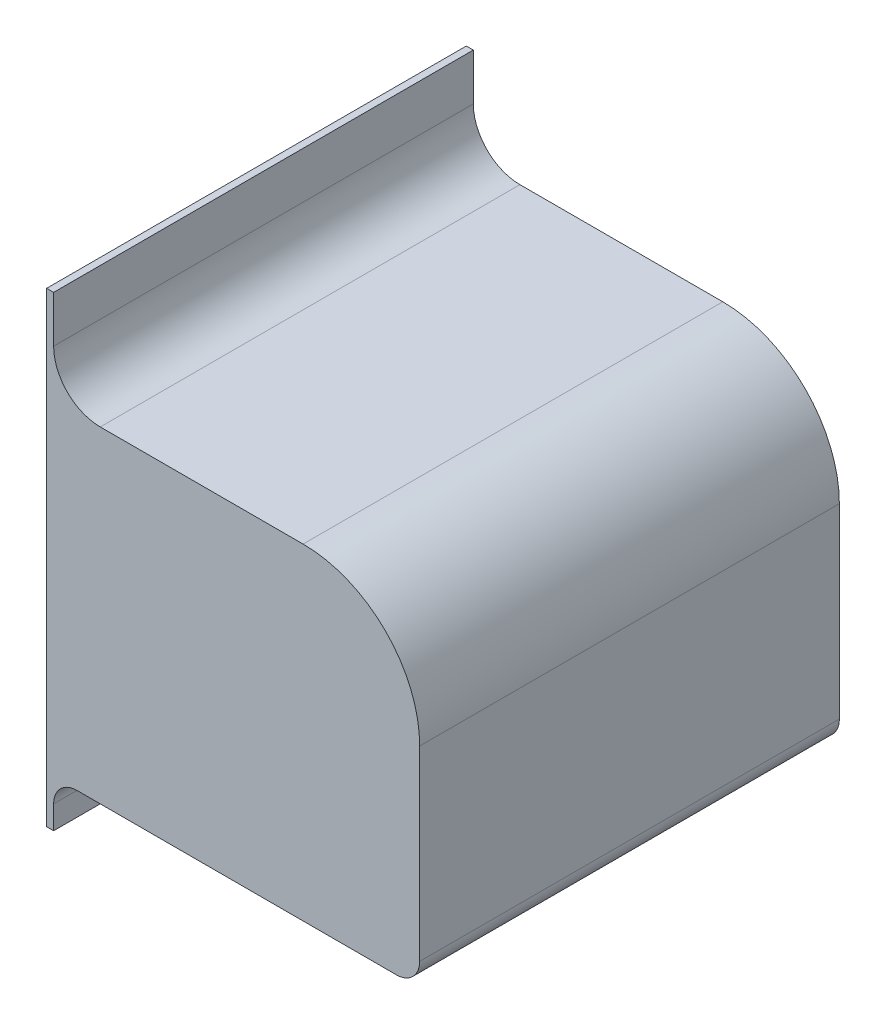
ISO-10303-21;
HEADER;
FILE_DESCRIPTION(('STEP AP214'),'2;1');
FILE_NAME('part.step','',(''),(''),'','','');
FILE_SCHEMA(('AUTOMOTIVE_DESIGN { 1 0 10303 214 1 1 1 1 }'));
ENDSEC;
DATA;
#1=APPLICATION_CONTEXT('core data for automotive mechanical design processes');
#2=APPLICATION_PROTOCOL_DEFINITION('international standard','automotive_design',2000,#1);
#3=PRODUCT_CONTEXT('',#1,'mechanical');
#4=PRODUCT('Part','Part','',(#3));
#5=PRODUCT_RELATED_PRODUCT_CATEGORY('part','',(#4));
#6=PRODUCT_DEFINITION_FORMATION('','',#4);
#7=PRODUCT_DEFINITION_CONTEXT('part definition',#1,'design');
#8=PRODUCT_DEFINITION('design','',#6,#7);
#9=PRODUCT_DEFINITION_SHAPE('','',#8);
#10=(LENGTH_UNIT() NAMED_UNIT(*) SI_UNIT(.MILLI.,.METRE.));
#11=(NAMED_UNIT(*) PLANE_ANGLE_UNIT() SI_UNIT($,.RADIAN.));
#12=(NAMED_UNIT(*) SI_UNIT($,.STERADIAN.) SOLID_ANGLE_UNIT());
#13=UNCERTAINTY_MEASURE_WITH_UNIT(LENGTH_MEASURE(1.E-05),#10,'distance_accuracy_value','');
#14=(GEOMETRIC_REPRESENTATION_CONTEXT(3) GLOBAL_UNCERTAINTY_ASSIGNED_CONTEXT((#13)) GLOBAL_UNIT_ASSIGNED_CONTEXT((#10,
#11,#12)) REPRESENTATION_CONTEXT('',''));
#15=CARTESIAN_POINT('',(0.,0.,0.));
#16=DIRECTION('',(0.,0.,1.));
#17=DIRECTION('',(1.,0.,0.));
#18=AXIS2_PLACEMENT_3D('',#15,#16,#17);
#19=CARTESIAN_POINT('',(0.,0.,40.));
#20=DIRECTION('',(0.,0.,-1.));
#21=DIRECTION('',(-1.,0.,0.));
#22=AXIS2_PLACEMENT_3D('',#19,#20,#21);
#23=PLANE('',#22);
#24=CARTESIAN_POINT('',(-28.5,50.,40.));
#25=DIRECTION('',(0.,0.,-1.));
#26=DIRECTION('',(-1.,0.,0.));
#27=AXIS2_PLACEMENT_3D('',#24,#25,#26);
#28=CIRCLE('',#27,10.);
#29=CARTESIAN_POINT('',(-38.5,50.0000000000001,40.));
#30=VERTEX_POINT('',#29);
#31=CARTESIAN_POINT('',(-28.4999999999999,40.,40.));
#32=VERTEX_POINT('',#31);
#33=EDGE_CURVE('E289',#30,#32,#28,.F.);
#34=ORIENTED_EDGE('',*,*,#33,.T.);
#35=DIRECTION('',(1.,0.,0.));
#36=VECTOR('',#35,1.);
#37=CARTESIAN_POINT('',(-28.4999999999999,40.,40.));
#38=LINE('',#37,#36);
#39=CARTESIAN_POINT('',(14.9999999999998,40.,40.));
#40=VERTEX_POINT('',#39);
#41=EDGE_CURVE('E294',#32,#40,#38,.T.);
#42=ORIENTED_EDGE('',*,*,#41,.T.);
#43=CARTESIAN_POINT('',(15.,15.,40.));
#44=DIRECTION('',(0.,0.,-1.));
#45=DIRECTION('',(-1.,0.,0.));
#46=AXIS2_PLACEMENT_3D('',#43,#44,#45);
#47=CIRCLE('',#46,25.);
#48=CARTESIAN_POINT('',(40.,14.9999999999998,40.));
#49=VERTEX_POINT('',#48);
#50=EDGE_CURVE('E188',#40,#49,#47,.T.);
#51=ORIENTED_EDGE('',*,*,#50,.T.);
#52=DIRECTION('',(0.,-1.,0.));
#53=VECTOR('',#52,1.);
#54=CARTESIAN_POINT('',(40.,0.,40.));
#55=LINE('',#54,#53);
#56=CARTESIAN_POINT('',(40.,-25.,40.));
#57=VERTEX_POINT('',#56);
#58=EDGE_CURVE('E291',#49,#57,#55,.T.);
#59=ORIENTED_EDGE('',*,*,#58,.T.);
#60=CARTESIAN_POINT('',(35.,-25.,40.));
#61=DIRECTION('',(0.,0.,-1.));
#62=DIRECTION('',(-1.,0.,0.));
#63=AXIS2_PLACEMENT_3D('',#60,#61,#62);
#64=CIRCLE('',#63,5.);
#65=CARTESIAN_POINT('',(35.,-30.,40.));
#66=VERTEX_POINT('',#65);
#67=EDGE_CURVE('E180',#57,#66,#64,.T.);
#68=ORIENTED_EDGE('',*,*,#67,.T.);
#69=DIRECTION('',(-1.,0.,0.));
#70=VECTOR('',#69,1.);
#71=CARTESIAN_POINT('',(35.,-30.,40.));
#72=LINE('',#71,#70);
#73=CARTESIAN_POINT('',(-33.5,-30.,40.));
#74=VERTEX_POINT('',#73);
#75=EDGE_CURVE('E283',#66,#74,#72,.T.);
#76=ORIENTED_EDGE('',*,*,#75,.T.);
#77=CARTESIAN_POINT('',(-33.5,-35.,40.));
#78=DIRECTION('',(0.,0.,-1.));
#79=DIRECTION('',(-1.,0.,0.));
#80=AXIS2_PLACEMENT_3D('',#77,#78,#79);
#81=CIRCLE('',#80,5.);
#82=CARTESIAN_POINT('',(-38.5,-35.,40.));
#83=VERTEX_POINT('',#82);
#84=EDGE_CURVE('E179',#74,#83,#81,.F.);
#85=ORIENTED_EDGE('',*,*,#84,.T.);
#86=DIRECTION('',(0.,-1.,0.));
#87=VECTOR('',#86,1.);
#88=CARTESIAN_POINT('',(-38.5,-40.,40.));
#89=LINE('',#88,#87);
#90=CARTESIAN_POINT('',(-38.5,-40.,40.));
#91=VERTEX_POINT('',#90);
#92=EDGE_CURVE('E186',#83,#91,#89,.T.);
#93=ORIENTED_EDGE('',*,*,#92,.T.);
#94=DIRECTION('',(-1.,0.,0.));
#95=VECTOR('',#94,1.);
#96=CARTESIAN_POINT('',(-40.,-40.,40.));
#97=LINE('',#96,#95);
#98=CARTESIAN_POINT('',(-40.,-40.,40.));
#99=VERTEX_POINT('',#98);
#100=EDGE_CURVE('E164',#91,#99,#97,.T.);
#101=ORIENTED_EDGE('',*,*,#100,.T.);
#102=DIRECTION('',(0.,1.,0.));
#103=VECTOR('',#102,1.);
#104=CARTESIAN_POINT('',(-40.,0.,40.));
#105=LINE('',#104,#103);
#106=CARTESIAN_POINT('',(-40.,60.,40.));
#107=VERTEX_POINT('',#106);
#108=EDGE_CURVE('E172',#99,#107,#105,.T.);
#109=ORIENTED_EDGE('',*,*,#108,.T.);
#110=DIRECTION('',(1.,0.,0.));
#111=VECTOR('',#110,1.);
#112=CARTESIAN_POINT('',(-40.,60.,40.));
#113=LINE('',#112,#111);
#114=CARTESIAN_POINT('',(-38.5,60.,40.));
#115=VERTEX_POINT('',#114);
#116=EDGE_CURVE('E169',#107,#115,#113,.T.);
#117=ORIENTED_EDGE('',*,*,#116,.T.);
#118=DIRECTION('',(0.,-1.,0.));
#119=VECTOR('',#118,1.);
#120=CARTESIAN_POINT('',(-38.5,60.,40.));
#121=LINE('',#120,#119);
#122=EDGE_CURVE('E280',#115,#30,#121,.T.);
#123=ORIENTED_EDGE('',*,*,#122,.T.);
#124=EDGE_LOOP('',(#34,#42,#51,#59,#68,#76,#85,#93,#101,#109,#117,#123));
#125=FACE_BOUND('',#124,.T.);
#126=DIRECTION('',(0.,-1.,0.));
#127=VECTOR('',#126,1.);
#128=CARTESIAN_POINT('',(38.,14.9999999999998,40.));
#129=LINE('',#128,#127);
#130=CARTESIAN_POINT('',(38.,14.9999999999998,40.));
#131=VERTEX_POINT('',#130);
#132=CARTESIAN_POINT('',(38.,-25.,40.));
#133=VERTEX_POINT('',#132);
#134=EDGE_CURVE('E42',#131,#133,#129,.T.);
#135=ORIENTED_EDGE('',*,*,#134,.F.);
#136=CARTESIAN_POINT('',(15.,15.,40.));
#137=DIRECTION('',(0.,0.,-1.));
#138=DIRECTION('',(-1.,0.,0.));
#139=AXIS2_PLACEMENT_3D('',#136,#137,#138);
#140=CIRCLE('',#139,23.);
#141=CARTESIAN_POINT('',(14.9999999999998,38.,40.));
#142=VERTEX_POINT('',#141);
#143=EDGE_CURVE('E11',#142,#131,#140,.T.);
#144=ORIENTED_EDGE('',*,*,#143,.F.);
#145=DIRECTION('',(1.,0.,0.));
#146=VECTOR('',#145,1.);
#147=CARTESIAN_POINT('',(-28.4999999999999,38.,40.));
#148=LINE('',#147,#146);
#149=CARTESIAN_POINT('',(-38.,38.,40.));
#150=VERTEX_POINT('',#149);
#151=EDGE_CURVE('E269',#150,#142,#148,.T.);
#152=ORIENTED_EDGE('',*,*,#151,.F.);
#153=DIRECTION('',(0.,1.,0.));
#154=VECTOR('',#153,1.);
#155=CARTESIAN_POINT('',(-38.,-28.,40.));
#156=LINE('',#155,#154);
#157=CARTESIAN_POINT('',(-38.,-28.,40.));
#158=VERTEX_POINT('',#157);
#159=EDGE_CURVE('E276',#158,#150,#156,.T.);
#160=ORIENTED_EDGE('',*,*,#159,.F.);
#161=DIRECTION('',(-1.,0.,0.));
#162=VECTOR('',#161,1.);
#163=CARTESIAN_POINT('',(-33.5,-28.,40.));
#164=LINE('',#163,#162);
#165=CARTESIAN_POINT('',(35.,-28.,40.));
#166=VERTEX_POINT('',#165);
#167=EDGE_CURVE('E274',#166,#158,#164,.T.);
#168=ORIENTED_EDGE('',*,*,#167,.F.);
#169=CARTESIAN_POINT('',(35.,-25.,40.));
#170=DIRECTION('',(0.,0.,-1.));
#171=DIRECTION('',(-1.,0.,0.));
#172=AXIS2_PLACEMENT_3D('',#169,#170,#171);
#173=CIRCLE('',#172,3.);
#174=EDGE_CURVE('E272',#133,#166,#173,.T.);
#175=ORIENTED_EDGE('',*,*,#174,.F.);
#176=EDGE_LOOP('',(#135,#144,#152,#160,#168,#175));
#177=FACE_BOUND('',#176,.T.);
#178=ADVANCED_FACE('F33',(#125,#177),#23,.T.);
#179=CARTESIAN_POINT('',(38.,14.9999999999998,128.));
#180=DIRECTION('',(1.,0.,0.));
#181=DIRECTION('',(0.,0.,-1.));
#182=AXIS2_PLACEMENT_3D('',#179,#180,#181);
#183=PLANE('',#182);
#184=ORIENTED_EDGE('',*,*,#134,.T.);
#185=DIRECTION('',(0.,0.,-1.));
#186=VECTOR('',#185,1.);
#187=CARTESIAN_POINT('',(38.,-25.,128.));
#188=LINE('',#187,#186);
#189=CARTESIAN_POINT('',(38.,-25.,128.));
#190=VERTEX_POINT('',#189);
#191=EDGE_CURVE('E243',#190,#133,#188,.T.);
#192=ORIENTED_EDGE('',*,*,#191,.F.);
#193=DIRECTION('',(0.,-1.,0.));
#194=VECTOR('',#193,1.);
#195=CARTESIAN_POINT('',(38.,14.9999999999998,128.));
#196=LINE('',#195,#194);
#197=CARTESIAN_POINT('',(38.,14.9999999999998,128.));
#198=VERTEX_POINT('',#197);
#199=EDGE_CURVE('E261',#198,#190,#196,.T.);
#200=ORIENTED_EDGE('',*,*,#199,.F.);
#201=DIRECTION('',(0.,0.,-1.));
#202=VECTOR('',#201,1.);
#203=CARTESIAN_POINT('',(38.,14.9999999999998,128.));
#204=LINE('',#203,#202);
#205=EDGE_CURVE('E241',#198,#131,#204,.T.);
#206=ORIENTED_EDGE('',*,*,#205,.T.);
#207=EDGE_LOOP('',(#184,#192,#200,#206));
#208=FACE_BOUND('',#207,.T.);
#209=ADVANCED_FACE('F354',(#208),#183,.F.);
#210=CARTESIAN_POINT('',(35.,-25.,128.));
#211=DIRECTION('',(0.,0.,-1.));
#212=DIRECTION('',(-1.,0.,0.));
#213=AXIS2_PLACEMENT_3D('',#210,#211,#212);
#214=CYLINDRICAL_SURFACE('',#213,3.);
#215=ORIENTED_EDGE('',*,*,#174,.T.);
#216=DIRECTION('',(0.,0.,-1.));
#217=VECTOR('',#216,1.);
#218=CARTESIAN_POINT('',(35.,-28.,128.));
#219=LINE('',#218,#217);
#220=CARTESIAN_POINT('',(35.,-28.,128.));
#221=VERTEX_POINT('',#220);
#222=EDGE_CURVE('E246',#221,#166,#219,.T.);
#223=ORIENTED_EDGE('',*,*,#222,.F.);
#224=CARTESIAN_POINT('',(35.,-25.,128.));
#225=DIRECTION('',(0.,0.,-1.));
#226=DIRECTION('',(-1.,0.,0.));
#227=AXIS2_PLACEMENT_3D('',#224,#225,#226);
#228=CIRCLE('',#227,3.);
#229=EDGE_CURVE('E258',#190,#221,#228,.T.);
#230=ORIENTED_EDGE('',*,*,#229,.F.);
#231=ORIENTED_EDGE('',*,*,#191,.T.);
#232=EDGE_LOOP('',(#215,#223,#230,#231));
#233=FACE_BOUND('',#232,.T.);
#234=ADVANCED_FACE('F356',(#233),#214,.F.);
#235=CARTESIAN_POINT('',(-33.5,-28.,128.));
#236=DIRECTION('',(0.,-1.,0.));
#237=DIRECTION('',(1.,0.,0.));
#238=AXIS2_PLACEMENT_3D('',#235,#236,#237);
#239=PLANE('',#238);
#240=ORIENTED_EDGE('',*,*,#167,.T.);
#241=DIRECTION('',(0.,0.,-1.));
#242=VECTOR('',#241,1.);
#243=CARTESIAN_POINT('',(-38.,-28.,128.));
#244=LINE('',#243,#242);
#245=CARTESIAN_POINT('',(-38.,-28.,128.));
#246=VERTEX_POINT('',#245);
#247=EDGE_CURVE('E249',#246,#158,#244,.T.);
#248=ORIENTED_EDGE('',*,*,#247,.F.);
#249=DIRECTION('',(-1.,0.,0.));
#250=VECTOR('',#249,1.);
#251=CARTESIAN_POINT('',(35.,-28.,128.));
#252=LINE('',#251,#250);
#253=EDGE_CURVE('E256',#221,#246,#252,.T.);
#254=ORIENTED_EDGE('',*,*,#253,.F.);
#255=ORIENTED_EDGE('',*,*,#222,.T.);
#256=EDGE_LOOP('',(#240,#248,#254,#255));
#257=FACE_BOUND('',#256,.T.);
#258=ADVANCED_FACE('F362',(#257),#239,.F.);
#259=CARTESIAN_POINT('',(-38.,-28.,128.));
#260=DIRECTION('',(-1.,0.,0.));
#261=DIRECTION('',(0.,0.,1.));
#262=AXIS2_PLACEMENT_3D('',#259,#260,#261);
#263=PLANE('',#262);
#264=ORIENTED_EDGE('',*,*,#159,.T.);
#265=DIRECTION('',(0.,0.,-1.));
#266=VECTOR('',#265,1.);
#267=CARTESIAN_POINT('',(-38.,38.,128.));
#268=LINE('',#267,#266);
#269=CARTESIAN_POINT('',(-38.,38.,128.));
#270=VERTEX_POINT('',#269);
#271=EDGE_CURVE('E236',#270,#150,#268,.T.);
#272=ORIENTED_EDGE('',*,*,#271,.F.);
#273=DIRECTION('',(0.,1.,0.));
#274=VECTOR('',#273,1.);
#275=CARTESIAN_POINT('',(-38.,-28.,128.));
#276=LINE('',#275,#274);
#277=EDGE_CURVE('E240',#246,#270,#276,.T.);
#278=ORIENTED_EDGE('',*,*,#277,.F.);
#279=ORIENTED_EDGE('',*,*,#247,.T.);
#280=EDGE_LOOP('',(#264,#272,#278,#279));
#281=FACE_BOUND('',#280,.T.);
#282=ADVANCED_FACE('F372',(#281),#263,.F.);
#283=CARTESIAN_POINT('',(15.,15.,128.));
#284=DIRECTION('',(0.,0.,-1.));
#285=DIRECTION('',(-1.,0.,0.));
#286=AXIS2_PLACEMENT_3D('',#283,#284,#285);
#287=PLANE('',#286);
#288=DIRECTION('',(1.,0.,0.));
#289=VECTOR('',#288,1.);
#290=CARTESIAN_POINT('',(-28.4999999999999,38.,128.));
#291=LINE('',#290,#289);
#292=CARTESIAN_POINT('',(14.9999999999998,38.,128.));
#293=VERTEX_POINT('',#292);
#294=EDGE_CURVE('E267',#270,#293,#291,.T.);
#295=ORIENTED_EDGE('',*,*,#294,.T.);
#296=CARTESIAN_POINT('',(15.,15.,128.));
#297=DIRECTION('',(0.,0.,-1.));
#298=DIRECTION('',(-1.,0.,0.));
#299=AXIS2_PLACEMENT_3D('',#296,#297,#298);
#300=CIRCLE('',#299,23.);
#301=EDGE_CURVE('E264',#293,#198,#300,.T.);
#302=ORIENTED_EDGE('',*,*,#301,.T.);
#303=ORIENTED_EDGE('',*,*,#199,.T.);
#304=ORIENTED_EDGE('',*,*,#229,.T.);
#305=ORIENTED_EDGE('',*,*,#253,.T.);
#306=ORIENTED_EDGE('',*,*,#277,.T.);
#307=EDGE_LOOP('',(#295,#302,#303,#304,#305,#306));
#308=FACE_BOUND('',#307,.T.);
#309=ADVANCED_FACE('F376',(#308),#287,.T.);
#310=CARTESIAN_POINT('',(15.,15.,128.));
#311=DIRECTION('',(0.,0.,-1.));
#312=DIRECTION('',(-1.,0.,0.));
#313=AXIS2_PLACEMENT_3D('',#310,#311,#312);
#314=CYLINDRICAL_SURFACE('',#313,23.);
#315=ORIENTED_EDGE('',*,*,#143,.T.);
#316=ORIENTED_EDGE('',*,*,#205,.F.);
#317=ORIENTED_EDGE('',*,*,#301,.F.);
#318=DIRECTION('',(0.,0.,-1.));
#319=VECTOR('',#318,1.);
#320=CARTESIAN_POINT('',(14.9999999999998,38.,128.));
#321=LINE('',#320,#319);
#322=EDGE_CURVE('E237',#293,#142,#321,.T.);
#323=ORIENTED_EDGE('',*,*,#322,.T.);
#324=EDGE_LOOP('',(#315,#316,#317,#323));
#325=FACE_BOUND('',#324,.T.);
#326=ADVANCED_FACE('F367',(#325),#314,.F.);
#327=CARTESIAN_POINT('',(-28.4999999999999,38.,128.));
#328=DIRECTION('',(0.,1.,0.));
#329=DIRECTION('',(0.,0.,1.));
#330=AXIS2_PLACEMENT_3D('',#327,#328,#329);
#331=PLANE('',#330);
#332=ORIENTED_EDGE('',*,*,#151,.T.);
#333=ORIENTED_EDGE('',*,*,#322,.F.);
#334=ORIENTED_EDGE('',*,*,#294,.F.);
#335=ORIENTED_EDGE('',*,*,#271,.T.);
#336=EDGE_LOOP('',(#332,#333,#334,#335));
#337=FACE_BOUND('',#336,.T.);
#338=ADVANCED_FACE('F378',(#337),#331,.F.);
#339=CARTESIAN_POINT('',(-40.,60.,130.));
#340=DIRECTION('',(0.,-1.,0.));
#341=DIRECTION('',(0.,0.,-1.));
#342=AXIS2_PLACEMENT_3D('',#339,#340,#341);
#343=PLANE('',#342);
#344=ORIENTED_EDGE('',*,*,#116,.F.);
#345=DIRECTION('',(0.,0.,-1.));
#346=VECTOR('',#345,1.);
#347=CARTESIAN_POINT('',(-40.,60.,130.));
#348=LINE('',#347,#346);
#349=CARTESIAN_POINT('',(-40.,60.,130.));
#350=VERTEX_POINT('',#349);
#351=EDGE_CURVE('E175',#350,#107,#348,.T.);
#352=ORIENTED_EDGE('',*,*,#351,.F.);
#353=DIRECTION('',(-1.,0.,0.));
#354=VECTOR('',#353,1.);
#355=CARTESIAN_POINT('',(-40.,60.,130.));
#356=LINE('',#355,#354);
#357=CARTESIAN_POINT('',(-38.5,60.,130.));
#358=VERTEX_POINT('',#357);
#359=EDGE_CURVE('E213',#358,#350,#356,.T.);
#360=ORIENTED_EDGE('',*,*,#359,.F.);
#361=DIRECTION('',(0.,0.,-1.));
#362=VECTOR('',#361,1.);
#363=CARTESIAN_POINT('',(-38.5,60.,130.));
#364=LINE('',#363,#362);
#365=EDGE_CURVE('E208',#358,#115,#364,.T.);
#366=ORIENTED_EDGE('',*,*,#365,.T.);
#367=EDGE_LOOP('',(#344,#352,#360,#366));
#368=FACE_BOUND('',#367,.T.);
#369=ADVANCED_FACE('F332',(#368),#343,.F.);
#370=CARTESIAN_POINT('',(-38.5,60.,130.));
#371=DIRECTION('',(-1.,0.,0.));
#372=DIRECTION('',(0.,0.,1.));
#373=AXIS2_PLACEMENT_3D('',#370,#371,#372);
#374=PLANE('',#373);
#375=ORIENTED_EDGE('',*,*,#122,.F.);
#376=ORIENTED_EDGE('',*,*,#365,.F.);
#377=DIRECTION('',(0.,1.,0.));
#378=VECTOR('',#377,1.);
#379=CARTESIAN_POINT('',(-38.5,60.,130.));
#380=LINE('',#379,#378);
#381=CARTESIAN_POINT('',(-38.5,50.0000000000001,130.));
#382=VERTEX_POINT('',#381);
#383=EDGE_CURVE('E215',#382,#358,#380,.T.);
#384=ORIENTED_EDGE('',*,*,#383,.F.);
#385=DIRECTION('',(0.,0.,-1.));
#386=VECTOR('',#385,1.);
#387=CARTESIAN_POINT('',(-38.5,50.0000000000001,130.));
#388=LINE('',#387,#386);
#389=EDGE_CURVE('E206',#382,#30,#388,.T.);
#390=ORIENTED_EDGE('',*,*,#389,.T.);
#391=EDGE_LOOP('',(#375,#376,#384,#390));
#392=FACE_BOUND('',#391,.T.);
#393=ADVANCED_FACE('F336',(#392),#374,.F.);
#394=CARTESIAN_POINT('',(35.,-30.,130.));
#395=DIRECTION('',(0.,1.,0.));
#396=DIRECTION('',(-1.,0.,0.));
#397=AXIS2_PLACEMENT_3D('',#394,#395,#396);
#398=PLANE('',#397);
#399=ORIENTED_EDGE('',*,*,#75,.F.);
#400=DIRECTION('',(0.,0.,-1.));
#401=VECTOR('',#400,1.);
#402=CARTESIAN_POINT('',(35.,-30.,130.));
#403=LINE('',#402,#401);
#404=CARTESIAN_POINT('',(35.,-30.,130.));
#405=VERTEX_POINT('',#404);
#406=EDGE_CURVE('E197',#405,#66,#403,.T.);
#407=ORIENTED_EDGE('',*,*,#406,.F.);
#408=DIRECTION('',(1.,0.,0.));
#409=VECTOR('',#408,1.);
#410=CARTESIAN_POINT('',(35.,-30.,130.));
#411=LINE('',#410,#409);
#412=CARTESIAN_POINT('',(-33.5,-30.,130.));
#413=VERTEX_POINT('',#412);
#414=EDGE_CURVE('E227',#413,#405,#411,.T.);
#415=ORIENTED_EDGE('',*,*,#414,.F.);
#416=DIRECTION('',(0.,0.,-1.));
#417=VECTOR('',#416,1.);
#418=CARTESIAN_POINT('',(-33.5,-30.,130.));
#419=LINE('',#418,#417);
#420=EDGE_CURVE('E195',#413,#74,#419,.T.);
#421=ORIENTED_EDGE('',*,*,#420,.T.);
#422=EDGE_LOOP('',(#399,#407,#415,#421));
#423=FACE_BOUND('',#422,.T.);
#424=ADVANCED_FACE('F344',(#423),#398,.F.);
#425=CARTESIAN_POINT('',(-33.5,-35.,130.));
#426=DIRECTION('',(0.,0.,-1.));
#427=DIRECTION('',(-1.,0.,0.));
#428=AXIS2_PLACEMENT_3D('',#425,#426,#427);
#429=CYLINDRICAL_SURFACE('',#428,5.);
#430=ORIENTED_EDGE('',*,*,#84,.F.);
#431=ORIENTED_EDGE('',*,*,#420,.F.);
#432=CARTESIAN_POINT('',(-33.5,-35.,130.));
#433=DIRECTION('',(0.,0.,-1.));
#434=DIRECTION('',(-1.,0.,0.));
#435=AXIS2_PLACEMENT_3D('',#432,#433,#434);
#436=CIRCLE('',#435,5.);
#437=CARTESIAN_POINT('',(-38.5,-35.,130.));
#438=VERTEX_POINT('',#437);
#439=EDGE_CURVE('E229',#438,#413,#436,.T.);
#440=ORIENTED_EDGE('',*,*,#439,.F.);
#441=DIRECTION('',(0.,0.,-1.));
#442=VECTOR('',#441,1.);
#443=CARTESIAN_POINT('',(-38.5,-35.,130.));
#444=LINE('',#443,#442);
#445=EDGE_CURVE('E193',#438,#83,#444,.T.);
#446=ORIENTED_EDGE('',*,*,#445,.T.);
#447=EDGE_LOOP('',(#430,#431,#440,#446));
#448=FACE_BOUND('',#447,.T.);
#449=ADVANCED_FACE('F319',(#448),#429,.F.);
#450=CARTESIAN_POINT('',(-40.,0.,40.));
#451=DIRECTION('',(1.,0.,0.));
#452=DIRECTION('',(0.,0.,-1.));
#453=AXIS2_PLACEMENT_3D('',#450,#451,#452);
#454=PLANE('',#453);
#455=ORIENTED_EDGE('',*,*,#108,.F.);
#456=DIRECTION('',(0.,0.,-1.));
#457=VECTOR('',#456,1.);
#458=CARTESIAN_POINT('',(-40.,-40.,130.));
#459=LINE('',#458,#457);
#460=CARTESIAN_POINT('',(-40.,-40.,130.));
#461=VERTEX_POINT('',#460);
#462=EDGE_CURVE('E159',#461,#99,#459,.T.);
#463=ORIENTED_EDGE('',*,*,#462,.F.);
#464=DIRECTION('',(0.,-1.,0.));
#465=VECTOR('',#464,1.);
#466=CARTESIAN_POINT('',(-40.,40.,130.));
#467=LINE('',#466,#465);
#468=EDGE_CURVE('E234',#350,#461,#467,.T.);
#469=ORIENTED_EDGE('',*,*,#468,.F.);
#470=ORIENTED_EDGE('',*,*,#351,.T.);
#471=EDGE_LOOP('',(#455,#463,#469,#470));
#472=FACE_BOUND('',#471,.T.);
#473=ADVANCED_FACE('F173',(#472),#454,.F.);
#474=CARTESIAN_POINT('',(35.,-25.,130.));
#475=DIRECTION('',(0.,0.,-1.));
#476=DIRECTION('',(-1.,0.,0.));
#477=AXIS2_PLACEMENT_3D('',#474,#475,#476);
#478=CYLINDRICAL_SURFACE('',#477,5.);
#479=ORIENTED_EDGE('',*,*,#67,.F.);
#480=DIRECTION('',(0.,0.,-1.));
#481=VECTOR('',#480,1.);
#482=CARTESIAN_POINT('',(40.,-25.,130.));
#483=LINE('',#482,#481);
#484=CARTESIAN_POINT('',(40.,-25.,130.));
#485=VERTEX_POINT('',#484);
#486=EDGE_CURVE('E199',#485,#57,#483,.T.);
#487=ORIENTED_EDGE('',*,*,#486,.F.);
#488=CARTESIAN_POINT('',(35.,-25.,130.));
#489=DIRECTION('',(0.,0.,1.));
#490=DIRECTION('',(1.,0.,0.));
#491=AXIS2_PLACEMENT_3D('',#488,#489,#490);
#492=CIRCLE('',#491,5.);
#493=EDGE_CURVE('E225',#405,#485,#492,.T.);
#494=ORIENTED_EDGE('',*,*,#493,.F.);
#495=ORIENTED_EDGE('',*,*,#406,.T.);
#496=EDGE_LOOP('',(#479,#487,#494,#495));
#497=FACE_BOUND('',#496,.T.);
#498=ADVANCED_FACE('F312',(#497),#478,.T.);
#499=CARTESIAN_POINT('',(-28.5,50.,130.));
#500=DIRECTION('',(0.,0.,-1.));
#501=DIRECTION('',(-1.,0.,0.));
#502=AXIS2_PLACEMENT_3D('',#499,#500,#501);
#503=CYLINDRICAL_SURFACE('',#502,10.);
#504=ORIENTED_EDGE('',*,*,#33,.F.);
#505=ORIENTED_EDGE('',*,*,#389,.F.);
#506=CARTESIAN_POINT('',(-28.5,50.,130.));
#507=DIRECTION('',(0.,0.,-1.));
#508=DIRECTION('',(-1.,0.,0.));
#509=AXIS2_PLACEMENT_3D('',#506,#507,#508);
#510=CIRCLE('',#509,10.);
#511=CARTESIAN_POINT('',(-28.4999999999999,40.,130.));
#512=VERTEX_POINT('',#511);
#513=EDGE_CURVE('E217',#512,#382,#510,.T.);
#514=ORIENTED_EDGE('',*,*,#513,.F.);
#515=DIRECTION('',(0.,0.,-1.));
#516=VECTOR('',#515,1.);
#517=CARTESIAN_POINT('',(-28.4999999999999,40.,130.));
#518=LINE('',#517,#516);
#519=EDGE_CURVE('E204',#512,#32,#518,.T.);
#520=ORIENTED_EDGE('',*,*,#519,.T.);
#521=EDGE_LOOP('',(#504,#505,#514,#520));
#522=FACE_BOUND('',#521,.T.);
#523=ADVANCED_FACE('F340',(#522),#503,.F.);
#524=CARTESIAN_POINT('',(40.,0.,40.));
#525=DIRECTION('',(-1.,0.,0.));
#526=DIRECTION('',(0.,-1.,0.));
#527=AXIS2_PLACEMENT_3D('',#524,#525,#526);
#528=PLANE('',#527);
#529=ORIENTED_EDGE('',*,*,#58,.F.);
#530=DIRECTION('',(0.,0.,-1.));
#531=VECTOR('',#530,1.);
#532=CARTESIAN_POINT('',(40.,14.9999999999998,130.));
#533=LINE('',#532,#531);
#534=CARTESIAN_POINT('',(40.,14.9999999999998,130.));
#535=VERTEX_POINT('',#534);
#536=EDGE_CURVE('E200',#535,#49,#533,.T.);
#537=ORIENTED_EDGE('',*,*,#536,.F.);
#538=DIRECTION('',(0.,1.,0.));
#539=VECTOR('',#538,1.);
#540=CARTESIAN_POINT('',(40.,-14.9999999999998,130.));
#541=LINE('',#540,#539);
#542=EDGE_CURVE('E223',#485,#535,#541,.T.);
#543=ORIENTED_EDGE('',*,*,#542,.F.);
#544=ORIENTED_EDGE('',*,*,#486,.T.);
#545=EDGE_LOOP('',(#529,#537,#543,#544));
#546=FACE_BOUND('',#545,.T.);
#547=ADVANCED_FACE('F307',(#546),#528,.F.);
#548=CARTESIAN_POINT('',(-28.4999999999999,40.,130.));
#549=DIRECTION('',(0.,-1.,0.));
#550=DIRECTION('',(1.,0.,0.));
#551=AXIS2_PLACEMENT_3D('',#548,#549,#550);
#552=PLANE('',#551);
#553=ORIENTED_EDGE('',*,*,#41,.F.);
#554=ORIENTED_EDGE('',*,*,#519,.F.);
#555=DIRECTION('',(-1.,0.,0.));
#556=VECTOR('',#555,1.);
#557=CARTESIAN_POINT('',(-28.4999999999999,40.,130.));
#558=LINE('',#557,#556);
#559=CARTESIAN_POINT('',(14.9999999999998,40.,130.));
#560=VERTEX_POINT('',#559);
#561=EDGE_CURVE('E219',#560,#512,#558,.T.);
#562=ORIENTED_EDGE('',*,*,#561,.F.);
#563=DIRECTION('',(0.,0.,-1.));
#564=VECTOR('',#563,1.);
#565=CARTESIAN_POINT('',(14.9999999999998,40.,130.));
#566=LINE('',#565,#564);
#567=EDGE_CURVE('E202',#560,#40,#566,.T.);
#568=ORIENTED_EDGE('',*,*,#567,.T.);
#569=EDGE_LOOP('',(#553,#554,#562,#568));
#570=FACE_BOUND('',#569,.T.);
#571=ADVANCED_FACE('F343',(#570),#552,.F.);
#572=CARTESIAN_POINT('',(15.,15.,130.));
#573=DIRECTION('',(0.,0.,-1.));
#574=DIRECTION('',(-1.,0.,0.));
#575=AXIS2_PLACEMENT_3D('',#572,#573,#574);
#576=CYLINDRICAL_SURFACE('',#575,25.);
#577=ORIENTED_EDGE('',*,*,#50,.F.);
#578=ORIENTED_EDGE('',*,*,#567,.F.);
#579=CARTESIAN_POINT('',(15.,15.,130.));
#580=DIRECTION('',(0.,0.,1.));
#581=DIRECTION('',(1.,0.,0.));
#582=AXIS2_PLACEMENT_3D('',#579,#580,#581);
#583=CIRCLE('',#582,25.);
#584=EDGE_CURVE('E221',#535,#560,#583,.T.);
#585=ORIENTED_EDGE('',*,*,#584,.F.);
#586=ORIENTED_EDGE('',*,*,#536,.T.);
#587=EDGE_LOOP('',(#577,#578,#585,#586));
#588=FACE_BOUND('',#587,.T.);
#589=ADVANCED_FACE('F35',(#588),#576,.T.);
#590=CARTESIAN_POINT('',(-38.5,-40.,130.));
#591=DIRECTION('',(-1.,0.,0.));
#592=DIRECTION('',(0.,0.,1.));
#593=AXIS2_PLACEMENT_3D('',#590,#591,#592);
#594=PLANE('',#593);
#595=ORIENTED_EDGE('',*,*,#92,.F.);
#596=ORIENTED_EDGE('',*,*,#445,.F.);
#597=DIRECTION('',(0.,1.,0.));
#598=VECTOR('',#597,1.);
#599=CARTESIAN_POINT('',(-38.5,-40.,130.));
#600=LINE('',#599,#598);
#601=CARTESIAN_POINT('',(-38.5,-40.,130.));
#602=VERTEX_POINT('',#601);
#603=EDGE_CURVE('E231',#602,#438,#600,.T.);
#604=ORIENTED_EDGE('',*,*,#603,.F.);
#605=DIRECTION('',(0.,0.,-1.));
#606=VECTOR('',#605,1.);
#607=CARTESIAN_POINT('',(-38.5,-40.,130.));
#608=LINE('',#607,#606);
#609=EDGE_CURVE('E168',#602,#91,#608,.T.);
#610=ORIENTED_EDGE('',*,*,#609,.T.);
#611=EDGE_LOOP('',(#595,#596,#604,#610));
#612=FACE_BOUND('',#611,.T.);
#613=ADVANCED_FACE('F325',(#612),#594,.F.);
#614=CARTESIAN_POINT('',(-40.,-40.,130.));
#615=DIRECTION('',(0.,1.,0.));
#616=DIRECTION('',(0.,0.,1.));
#617=AXIS2_PLACEMENT_3D('',#614,#615,#616);
#618=PLANE('',#617);
#619=ORIENTED_EDGE('',*,*,#100,.F.);
#620=ORIENTED_EDGE('',*,*,#609,.F.);
#621=DIRECTION('',(1.,0.,0.));
#622=VECTOR('',#621,1.);
#623=CARTESIAN_POINT('',(-40.,-40.,130.));
#624=LINE('',#623,#622);
#625=EDGE_CURVE('E165',#461,#602,#624,.T.);
#626=ORIENTED_EDGE('',*,*,#625,.F.);
#627=ORIENTED_EDGE('',*,*,#462,.T.);
#628=EDGE_LOOP('',(#619,#620,#626,#627));
#629=FACE_BOUND('',#628,.T.);
#630=ADVANCED_FACE('F161',(#629),#618,.F.);
#631=CARTESIAN_POINT('',(-28.5,50.,130.));
#632=DIRECTION('',(0.,0.,-1.));
#633=DIRECTION('',(-1.,0.,0.));
#634=AXIS2_PLACEMENT_3D('',#631,#632,#633);
#635=PLANE('',#634);
#636=ORIENTED_EDGE('',*,*,#468,.T.);
#637=ORIENTED_EDGE('',*,*,#625,.T.);
#638=ORIENTED_EDGE('',*,*,#603,.T.);
#639=ORIENTED_EDGE('',*,*,#439,.T.);
#640=ORIENTED_EDGE('',*,*,#414,.T.);
#641=ORIENTED_EDGE('',*,*,#493,.T.);
#642=ORIENTED_EDGE('',*,*,#542,.T.);
#643=ORIENTED_EDGE('',*,*,#584,.T.);
#644=ORIENTED_EDGE('',*,*,#561,.T.);
#645=ORIENTED_EDGE('',*,*,#513,.T.);
#646=ORIENTED_EDGE('',*,*,#383,.T.);
#647=ORIENTED_EDGE('',*,*,#359,.T.);
#648=EDGE_LOOP('',(#636,#637,#638,#639,#640,#641,#642,#643,#644,#645,#646,#647));
#649=FACE_BOUND('',#648,.T.);
#650=ADVANCED_FACE('F327',(#649),#635,.F.);
#651=CLOSED_SHELL('',(#178,#209,#234,#258,#282,#309,#326,#338,#369,#393,#424,#449,#473,#498,
#523,#547,#571,#589,#613,#630,#650));
#652=MANIFOLD_SOLID_BREP('B2',#651);
#653=ADVANCED_BREP_SHAPE_REPRESENTATION('',(#18,#652),#14);
#654=SHAPE_DEFINITION_REPRESENTATION(#9,#653);
ENDSEC;
END-ISO-10303-21;
